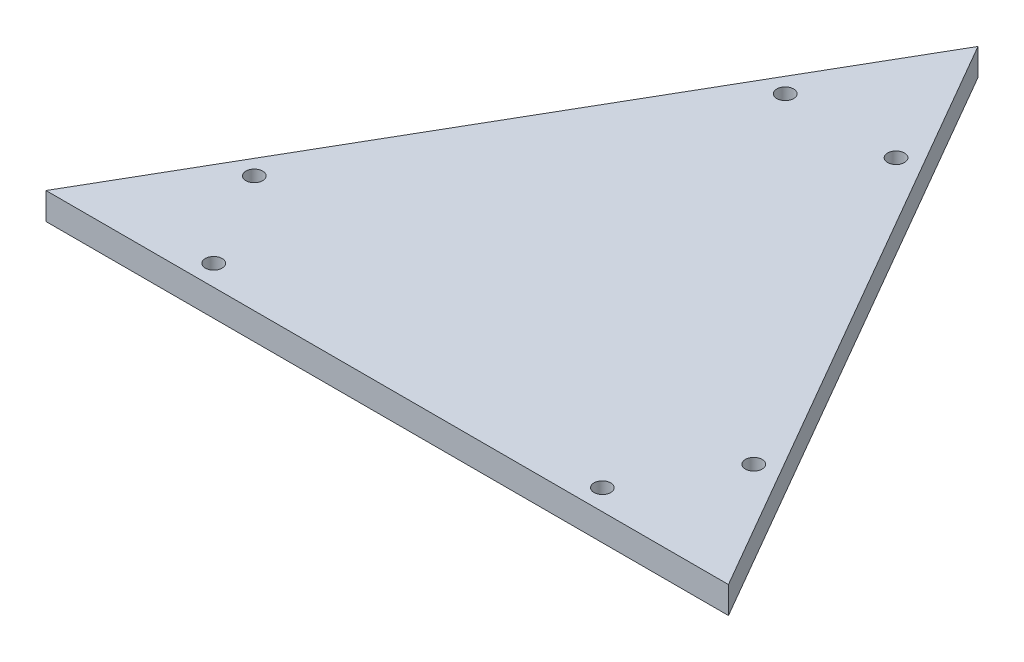
ISO-10303-21;
HEADER;
FILE_DESCRIPTION(('STEP AP214'),'2;1');
FILE_NAME('part.step','',(''),(''),'','','');
FILE_SCHEMA(('AUTOMOTIVE_DESIGN { 1 0 10303 214 1 1 1 1 }'));
ENDSEC;
DATA;
#1=APPLICATION_CONTEXT('core data for automotive mechanical design processes');
#2=APPLICATION_PROTOCOL_DEFINITION('international standard','automotive_design',2000,#1);
#3=PRODUCT_CONTEXT('',#1,'mechanical');
#4=PRODUCT('Part','Part','',(#3));
#5=PRODUCT_RELATED_PRODUCT_CATEGORY('part','',(#4));
#6=PRODUCT_DEFINITION_FORMATION('','',#4);
#7=PRODUCT_DEFINITION_CONTEXT('part definition',#1,'design');
#8=PRODUCT_DEFINITION('design','',#6,#7);
#9=PRODUCT_DEFINITION_SHAPE('','',#8);
#10=(LENGTH_UNIT() NAMED_UNIT(*) SI_UNIT(.MILLI.,.METRE.));
#11=(NAMED_UNIT(*) PLANE_ANGLE_UNIT() SI_UNIT($,.RADIAN.));
#12=(NAMED_UNIT(*) SI_UNIT($,.STERADIAN.) SOLID_ANGLE_UNIT());
#13=UNCERTAINTY_MEASURE_WITH_UNIT(LENGTH_MEASURE(1.E-05),#10,'distance_accuracy_value','');
#14=(GEOMETRIC_REPRESENTATION_CONTEXT(3) GLOBAL_UNCERTAINTY_ASSIGNED_CONTEXT((#13)) GLOBAL_UNIT_ASSIGNED_CONTEXT((#10,
#11,#12)) REPRESENTATION_CONTEXT('',''));
#15=CARTESIAN_POINT('',(0.,0.,0.));
#16=DIRECTION('',(0.,0.,1.));
#17=DIRECTION('',(1.,0.,0.));
#18=AXIS2_PLACEMENT_3D('',#15,#16,#17);
#19=CARTESIAN_POINT('',(-101.602540378444,8.,0.));
#20=DIRECTION('',(0.,0.,-1.));
#21=DIRECTION('',(-1.,0.,0.));
#22=AXIS2_PLACEMENT_3D('',#19,#20,#21);
#23=PLANE('',#22);
#24=DIRECTION('',(1.,0.,0.));
#25=VECTOR('',#24,1.);
#26=CARTESIAN_POINT('',(-101.602540378444,0.,0.));
#27=LINE('',#26,#25);
#28=CARTESIAN_POINT('',(-101.602540378444,0.,0.));
#29=VERTEX_POINT('',#28);
#30=CARTESIAN_POINT('',(101.602540378444,0.,0.));
#31=VERTEX_POINT('',#30);
#32=EDGE_CURVE('E82',#29,#31,#27,.T.);
#33=ORIENTED_EDGE('',*,*,#32,.T.);
#34=DIRECTION('',(0.,-1.,0.));
#35=VECTOR('',#34,1.);
#36=CARTESIAN_POINT('',(101.602540378444,8.,0.));
#37=LINE('',#36,#35);
#38=CARTESIAN_POINT('',(101.602540378444,8.,0.));
#39=VERTEX_POINT('',#38);
#40=EDGE_CURVE('E11',#39,#31,#37,.T.);
#41=ORIENTED_EDGE('',*,*,#40,.F.);
#42=DIRECTION('',(1.,0.,0.));
#43=VECTOR('',#42,1.);
#44=CARTESIAN_POINT('',(-101.602540378444,8.,0.));
#45=LINE('',#44,#43);
#46=CARTESIAN_POINT('',(-101.602540378444,8.,0.));
#47=VERTEX_POINT('',#46);
#48=EDGE_CURVE('E75',#47,#39,#45,.T.);
#49=ORIENTED_EDGE('',*,*,#48,.F.);
#50=DIRECTION('',(0.,-1.,0.));
#51=VECTOR('',#50,1.);
#52=CARTESIAN_POINT('',(-101.602540378444,8.,0.));
#53=LINE('',#52,#51);
#54=EDGE_CURVE('E83',#47,#29,#53,.T.);
#55=ORIENTED_EDGE('',*,*,#54,.T.);
#56=EDGE_LOOP('',(#33,#41,#49,#55));
#57=FACE_BOUND('',#56,.T.);
#58=ADVANCED_FACE('F33',(#57),#23,.F.);
#59=CARTESIAN_POINT('',(101.602540378444,8.,0.));
#60=DIRECTION('',(-0.865935865159321,0.,0.500155053389224));
#61=DIRECTION('',(0.500155053389224,0.,0.865935865159321));
#62=AXIS2_PLACEMENT_3D('',#59,#60,#61);
#63=PLANE('',#62);
#64=DIRECTION('',(-0.500155053389224,0.,-0.865935865159321));
#65=VECTOR('',#64,1.);
#66=CARTESIAN_POINT('',(101.602540378444,0.,0.));
#67=LINE('',#66,#65);
#68=CARTESIAN_POINT('',(0.,0.,-175.908017141486));
#69=VERTEX_POINT('',#68);
#70=EDGE_CURVE('E63',#31,#69,#67,.T.);
#71=ORIENTED_EDGE('',*,*,#70,.T.);
#72=DIRECTION('',(0.,-1.,0.));
#73=VECTOR('',#72,1.);
#74=CARTESIAN_POINT('',(0.,8.,-175.908017141486));
#75=LINE('',#74,#73);
#76=CARTESIAN_POINT('',(0.,8.,-175.908017141486));
#77=VERTEX_POINT('',#76);
#78=EDGE_CURVE('E42',#77,#69,#75,.T.);
#79=ORIENTED_EDGE('',*,*,#78,.F.);
#80=DIRECTION('',(-0.500155053389224,0.,-0.865935865159321));
#81=VECTOR('',#80,1.);
#82=CARTESIAN_POINT('',(101.602540378444,8.,0.));
#83=LINE('',#82,#81);
#84=EDGE_CURVE('E71',#39,#77,#83,.T.);
#85=ORIENTED_EDGE('',*,*,#84,.F.);
#86=ORIENTED_EDGE('',*,*,#40,.T.);
#87=EDGE_LOOP('',(#71,#79,#85,#86));
#88=FACE_BOUND('',#87,.T.);
#89=ADVANCED_FACE('F72',(#88),#63,.F.);
#90=CARTESIAN_POINT('',(0.,8.,-175.908017141486));
#91=DIRECTION('',(0.865935865159321,0.,0.500155053389224));
#92=DIRECTION('',(0.500155053389224,0.,-0.865935865159321));
#93=AXIS2_PLACEMENT_3D('',#90,#91,#92);
#94=PLANE('',#93);
#95=DIRECTION('',(-0.500155053389224,0.,0.865935865159321));
#96=VECTOR('',#95,1.);
#97=CARTESIAN_POINT('',(0.,0.,-175.908017141486));
#98=LINE('',#97,#96);
#99=EDGE_CURVE('E68',#69,#29,#98,.T.);
#100=ORIENTED_EDGE('',*,*,#99,.T.);
#101=ORIENTED_EDGE('',*,*,#54,.F.);
#102=DIRECTION('',(-0.500155053389224,0.,0.865935865159321));
#103=VECTOR('',#102,1.);
#104=CARTESIAN_POINT('',(0.,8.,-175.908017141486));
#105=LINE('',#104,#103);
#106=EDGE_CURVE('E51',#77,#47,#105,.T.);
#107=ORIENTED_EDGE('',*,*,#106,.F.);
#108=ORIENTED_EDGE('',*,*,#78,.T.);
#109=EDGE_LOOP('',(#100,#101,#107,#108));
#110=FACE_BOUND('',#109,.T.);
#111=ADVANCED_FACE('F133',(#110),#94,.F.);
#112=CARTESIAN_POINT('',(0.,8.,0.));
#113=DIRECTION('',(0.,1.,0.));
#114=DIRECTION('',(0.,0.,1.));
#115=AXIS2_PLACEMENT_3D('',#112,#113,#114);
#116=PLANE('',#115);
#117=CARTESIAN_POINT('',(74.3621593216773,8.,-34.7798002192098));
#118=DIRECTION('',(0.,1.,0.));
#119=DIRECTION('',(0.,0.,1.));
#120=AXIS2_PLACEMENT_3D('',#117,#118,#119);
#121=CIRCLE('',#120,2.5);
#122=CARTESIAN_POINT('',(74.3621593216773,8.,-32.2798002192098));
#123=VERTEX_POINT('',#122);
#124=EDGE_CURVE('E164',#123,#123,#121,.T.);
#125=ORIENTED_EDGE('',*,*,#124,.F.);
#126=EDGE_LOOP('',(#125));
#127=FACE_BOUND('',#126,.T.);
#128=CARTESIAN_POINT('',(16.5,8.,-135.));
#129=DIRECTION('',(0.,1.,0.));
#130=DIRECTION('',(0.,0.,1.));
#131=AXIS2_PLACEMENT_3D('',#128,#129,#130);
#132=CIRCLE('',#131,2.5);
#133=CARTESIAN_POINT('',(16.5,8.,-132.5));
#134=VERTEX_POINT('',#133);
#135=EDGE_CURVE('E159',#134,#134,#132,.T.);
#136=ORIENTED_EDGE('',*,*,#135,.F.);
#137=EDGE_LOOP('',(#136));
#138=FACE_BOUND('',#137,.T.);
#139=CARTESIAN_POINT('',(-57.8621593216772,8.,-6.20096189432334));
#140=DIRECTION('',(0.,1.,0.));
#141=DIRECTION('',(0.,0.,1.));
#142=AXIS2_PLACEMENT_3D('',#139,#140,#141);
#143=CIRCLE('',#142,2.5);
#144=CARTESIAN_POINT('',(-57.8621593216772,8.,-3.70096189432334));
#145=VERTEX_POINT('',#144);
#146=EDGE_CURVE('E161',#145,#145,#143,.T.);
#147=ORIENTED_EDGE('',*,*,#146,.F.);
#148=EDGE_LOOP('',(#147));
#149=FACE_BOUND('',#148,.T.);
#150=CARTESIAN_POINT('',(-74.3621593216772,8.,-34.7798002192098));
#151=DIRECTION('',(0.,1.,0.));
#152=DIRECTION('',(0.,0.,1.));
#153=AXIS2_PLACEMENT_3D('',#150,#151,#152);
#154=CIRCLE('',#153,2.49999999999998);
#155=CARTESIAN_POINT('',(-74.3621593216772,8.,-32.2798002192098));
#156=VERTEX_POINT('',#155);
#157=EDGE_CURVE('E169',#156,#156,#154,.T.);
#158=ORIENTED_EDGE('',*,*,#157,.F.);
#159=EDGE_LOOP('',(#158));
#160=FACE_BOUND('',#159,.T.);
#161=CARTESIAN_POINT('',(57.8621593216773,8.,-6.20096189432335));
#162=DIRECTION('',(0.,1.,0.));
#163=DIRECTION('',(0.,0.,1.));
#164=AXIS2_PLACEMENT_3D('',#161,#162,#163);
#165=CIRCLE('',#164,2.50000000000001);
#166=CARTESIAN_POINT('',(57.8621593216773,8.,-3.70096189432335));
#167=VERTEX_POINT('',#166);
#168=EDGE_CURVE('E167',#167,#167,#165,.T.);
#169=ORIENTED_EDGE('',*,*,#168,.F.);
#170=EDGE_LOOP('',(#169));
#171=FACE_BOUND('',#170,.T.);
#172=CARTESIAN_POINT('',(-16.5,8.,-135.));
#173=DIRECTION('',(0.,1.,0.));
#174=DIRECTION('',(0.,0.,1.));
#175=AXIS2_PLACEMENT_3D('',#172,#173,#174);
#176=CIRCLE('',#175,2.5);
#177=CARTESIAN_POINT('',(-16.5,8.,-132.5));
#178=VERTEX_POINT('',#177);
#179=EDGE_CURVE('E98',#178,#178,#176,.T.);
#180=ORIENTED_EDGE('',*,*,#179,.F.);
#181=EDGE_LOOP('',(#180));
#182=FACE_BOUND('',#181,.T.);
#183=ORIENTED_EDGE('',*,*,#48,.T.);
#184=ORIENTED_EDGE('',*,*,#84,.T.);
#185=ORIENTED_EDGE('',*,*,#106,.T.);
#186=EDGE_LOOP('',(#183,#184,#185));
#187=FACE_BOUND('',#186,.T.);
#188=ADVANCED_FACE('F78',(#127,#138,#149,#160,#171,#182,#187),#116,.T.);
#189=CARTESIAN_POINT('',(0.,0.,0.));
#190=DIRECTION('',(0.,1.,0.));
#191=DIRECTION('',(0.,0.,1.));
#192=AXIS2_PLACEMENT_3D('',#189,#190,#191);
#193=PLANE('',#192);
#194=CARTESIAN_POINT('',(74.3621593216773,0.,-34.7798002192098));
#195=DIRECTION('',(0.,1.,0.));
#196=DIRECTION('',(0.,0.,1.));
#197=AXIS2_PLACEMENT_3D('',#194,#195,#196);
#198=CIRCLE('',#197,2.5);
#199=CARTESIAN_POINT('',(74.3621593216773,0.,-32.2798002192098));
#200=VERTEX_POINT('',#199);
#201=EDGE_CURVE('E36',#200,#200,#198,.T.);
#202=ORIENTED_EDGE('',*,*,#201,.T.);
#203=EDGE_LOOP('',(#202));
#204=FACE_BOUND('',#203,.T.);
#205=CARTESIAN_POINT('',(16.5,0.,-135.));
#206=DIRECTION('',(0.,1.,0.));
#207=DIRECTION('',(0.,0.,1.));
#208=AXIS2_PLACEMENT_3D('',#205,#206,#207);
#209=CIRCLE('',#208,2.5);
#210=CARTESIAN_POINT('',(16.5,0.,-132.5));
#211=VERTEX_POINT('',#210);
#212=EDGE_CURVE('E88',#211,#211,#209,.T.);
#213=ORIENTED_EDGE('',*,*,#212,.T.);
#214=EDGE_LOOP('',(#213));
#215=FACE_BOUND('',#214,.T.);
#216=CARTESIAN_POINT('',(-57.8621593216772,0.,-6.20096189432334));
#217=DIRECTION('',(0.,1.,0.));
#218=DIRECTION('',(0.,0.,1.));
#219=AXIS2_PLACEMENT_3D('',#216,#217,#218);
#220=CIRCLE('',#219,2.5);
#221=CARTESIAN_POINT('',(-57.8621593216772,0.,-3.70096189432334));
#222=VERTEX_POINT('',#221);
#223=EDGE_CURVE('E104',#222,#222,#220,.T.);
#224=ORIENTED_EDGE('',*,*,#223,.T.);
#225=EDGE_LOOP('',(#224));
#226=FACE_BOUND('',#225,.T.);
#227=CARTESIAN_POINT('',(-74.3621593216772,0.,-34.7798002192098));
#228=DIRECTION('',(0.,1.,0.));
#229=DIRECTION('',(0.,0.,1.));
#230=AXIS2_PLACEMENT_3D('',#227,#228,#229);
#231=CIRCLE('',#230,2.49999999999998);
#232=CARTESIAN_POINT('',(-74.3621593216772,0.,-32.2798002192098));
#233=VERTEX_POINT('',#232);
#234=EDGE_CURVE('E101',#233,#233,#231,.T.);
#235=ORIENTED_EDGE('',*,*,#234,.T.);
#236=EDGE_LOOP('',(#235));
#237=FACE_BOUND('',#236,.T.);
#238=CARTESIAN_POINT('',(57.8621593216773,0.,-6.20096189432335));
#239=DIRECTION('',(0.,1.,0.));
#240=DIRECTION('',(0.,0.,1.));
#241=AXIS2_PLACEMENT_3D('',#238,#239,#240);
#242=CIRCLE('',#241,2.50000000000001);
#243=CARTESIAN_POINT('',(57.8621593216773,0.,-3.70096189432335));
#244=VERTEX_POINT('',#243);
#245=EDGE_CURVE('E97',#244,#244,#242,.T.);
#246=ORIENTED_EDGE('',*,*,#245,.T.);
#247=EDGE_LOOP('',(#246));
#248=FACE_BOUND('',#247,.T.);
#249=CARTESIAN_POINT('',(-16.5,0.,-135.));
#250=DIRECTION('',(0.,1.,0.));
#251=DIRECTION('',(0.,0.,1.));
#252=AXIS2_PLACEMENT_3D('',#249,#250,#251);
#253=CIRCLE('',#252,2.5);
#254=CARTESIAN_POINT('',(-16.5,0.,-132.5));
#255=VERTEX_POINT('',#254);
#256=EDGE_CURVE('E94',#255,#255,#253,.T.);
#257=ORIENTED_EDGE('',*,*,#256,.T.);
#258=EDGE_LOOP('',(#257));
#259=FACE_BOUND('',#258,.T.);
#260=ORIENTED_EDGE('',*,*,#32,.F.);
#261=ORIENTED_EDGE('',*,*,#99,.F.);
#262=ORIENTED_EDGE('',*,*,#70,.F.);
#263=EDGE_LOOP('',(#260,#261,#262));
#264=FACE_BOUND('',#263,.T.);
#265=ADVANCED_FACE('F109',(#204,#215,#226,#237,#248,#259,#264),#193,.F.);
#266=CARTESIAN_POINT('',(-16.5,-23.,-135.));
#267=DIRECTION('',(0.,1.,0.));
#268=DIRECTION('',(0.,0.,1.));
#269=AXIS2_PLACEMENT_3D('',#266,#267,#268);
#270=CYLINDRICAL_SURFACE('',#269,2.5);
#271=ORIENTED_EDGE('',*,*,#179,.T.);
#272=EDGE_LOOP('',(#271));
#273=FACE_BOUND('',#272,.T.);
#274=ORIENTED_EDGE('',*,*,#256,.F.);
#275=EDGE_LOOP('',(#274));
#276=FACE_BOUND('',#275,.T.);
#277=ADVANCED_FACE('F141',(#273,#276),#270,.F.);
#278=CARTESIAN_POINT('',(57.8621593216773,-23.,-6.20096189432335));
#279=DIRECTION('',(0.,1.,0.));
#280=DIRECTION('',(0.,0.,1.));
#281=AXIS2_PLACEMENT_3D('',#278,#279,#280);
#282=CYLINDRICAL_SURFACE('',#281,2.50000000000001);
#283=ORIENTED_EDGE('',*,*,#168,.T.);
#284=EDGE_LOOP('',(#283));
#285=FACE_BOUND('',#284,.T.);
#286=ORIENTED_EDGE('',*,*,#245,.F.);
#287=EDGE_LOOP('',(#286));
#288=FACE_BOUND('',#287,.T.);
#289=ADVANCED_FACE('F147',(#285,#288),#282,.F.);
#290=CARTESIAN_POINT('',(-74.3621593216772,-23.,-34.7798002192098));
#291=DIRECTION('',(0.,1.,0.));
#292=DIRECTION('',(0.,0.,1.));
#293=AXIS2_PLACEMENT_3D('',#290,#291,#292);
#294=CYLINDRICAL_SURFACE('',#293,2.49999999999998);
#295=ORIENTED_EDGE('',*,*,#157,.T.);
#296=EDGE_LOOP('',(#295));
#297=FACE_BOUND('',#296,.T.);
#298=ORIENTED_EDGE('',*,*,#234,.F.);
#299=EDGE_LOOP('',(#298));
#300=FACE_BOUND('',#299,.T.);
#301=ADVANCED_FACE('F124',(#297,#300),#294,.F.);
#302=CARTESIAN_POINT('',(-57.8621593216772,-23.,-6.20096189432334));
#303=DIRECTION('',(0.,1.,0.));
#304=DIRECTION('',(0.,0.,1.));
#305=AXIS2_PLACEMENT_3D('',#302,#303,#304);
#306=CYLINDRICAL_SURFACE('',#305,2.5);
#307=ORIENTED_EDGE('',*,*,#146,.T.);
#308=EDGE_LOOP('',(#307));
#309=FACE_BOUND('',#308,.T.);
#310=ORIENTED_EDGE('',*,*,#223,.F.);
#311=EDGE_LOOP('',(#310));
#312=FACE_BOUND('',#311,.T.);
#313=ADVANCED_FACE('F115',(#309,#312),#306,.F.);
#314=CARTESIAN_POINT('',(16.5,-23.,-135.));
#315=DIRECTION('',(0.,1.,0.));
#316=DIRECTION('',(0.,0.,1.));
#317=AXIS2_PLACEMENT_3D('',#314,#315,#316);
#318=CYLINDRICAL_SURFACE('',#317,2.5);
#319=ORIENTED_EDGE('',*,*,#135,.T.);
#320=EDGE_LOOP('',(#319));
#321=FACE_BOUND('',#320,.T.);
#322=ORIENTED_EDGE('',*,*,#212,.F.);
#323=EDGE_LOOP('',(#322));
#324=FACE_BOUND('',#323,.T.);
#325=ADVANCED_FACE('F112',(#321,#324),#318,.F.);
#326=CARTESIAN_POINT('',(74.3621593216773,-23.,-34.7798002192098));
#327=DIRECTION('',(0.,1.,0.));
#328=DIRECTION('',(0.,0.,1.));
#329=AXIS2_PLACEMENT_3D('',#326,#327,#328);
#330=CYLINDRICAL_SURFACE('',#329,2.5);
#331=ORIENTED_EDGE('',*,*,#124,.T.);
#332=EDGE_LOOP('',(#331));
#333=FACE_BOUND('',#332,.T.);
#334=ORIENTED_EDGE('',*,*,#201,.F.);
#335=EDGE_LOOP('',(#334));
#336=FACE_BOUND('',#335,.T.);
#337=ADVANCED_FACE('F114',(#333,#336),#330,.F.);
#338=CLOSED_SHELL('',(#58,#89,#111,#188,#265,#277,#289,#301,#313,#325,#337));
#339=MANIFOLD_SOLID_BREP('B2',#338);
#340=ADVANCED_BREP_SHAPE_REPRESENTATION('',(#18,#339),#14);
#341=SHAPE_DEFINITION_REPRESENTATION(#9,#340);
ENDSEC;
END-ISO-10303-21;
